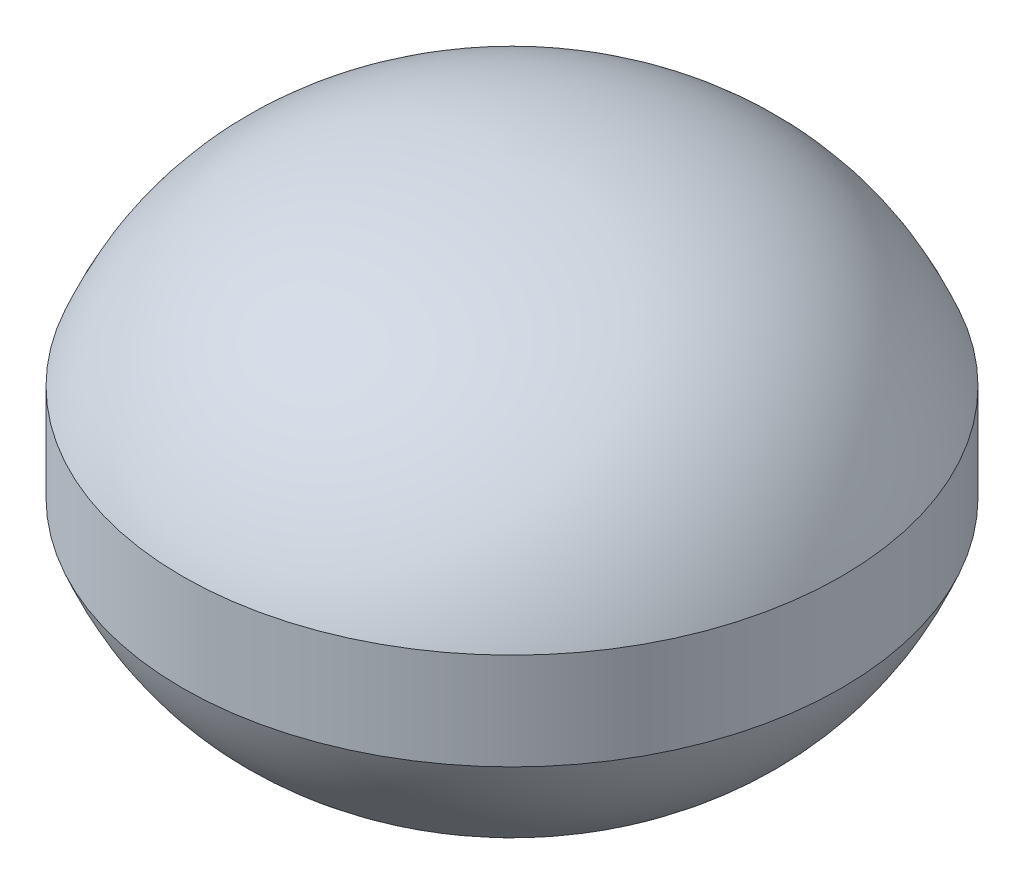
ISO-10303-21;
HEADER;
FILE_DESCRIPTION(('STEP AP214'),'2;1');
FILE_NAME('part.step','',(''),(''),'','','');
FILE_SCHEMA(('AUTOMOTIVE_DESIGN { 1 0 10303 214 1 1 1 1 }'));
ENDSEC;
DATA;
#1=APPLICATION_CONTEXT('core data for automotive mechanical design processes');
#2=APPLICATION_PROTOCOL_DEFINITION('international standard','automotive_design',2000,#1);
#3=PRODUCT_CONTEXT('',#1,'mechanical');
#4=PRODUCT('Part','Part','',(#3));
#5=PRODUCT_RELATED_PRODUCT_CATEGORY('part','',(#4));
#6=PRODUCT_DEFINITION_FORMATION('','',#4);
#7=PRODUCT_DEFINITION_CONTEXT('part definition',#1,'design');
#8=PRODUCT_DEFINITION('design','',#6,#7);
#9=PRODUCT_DEFINITION_SHAPE('','',#8);
#10=(LENGTH_UNIT() NAMED_UNIT(*) SI_UNIT(.MILLI.,.METRE.));
#11=(NAMED_UNIT(*) PLANE_ANGLE_UNIT() SI_UNIT($,.RADIAN.));
#12=(NAMED_UNIT(*) SI_UNIT($,.STERADIAN.) SOLID_ANGLE_UNIT());
#13=UNCERTAINTY_MEASURE_WITH_UNIT(LENGTH_MEASURE(1.E-05),#10,'distance_accuracy_value','');
#14=(GEOMETRIC_REPRESENTATION_CONTEXT(3) GLOBAL_UNCERTAINTY_ASSIGNED_CONTEXT((#13)) GLOBAL_UNIT_ASSIGNED_CONTEXT((#10,
#11,#12)) REPRESENTATION_CONTEXT('',''));
#15=CARTESIAN_POINT('',(0.,0.,0.));
#16=DIRECTION('',(0.,0.,1.));
#17=DIRECTION('',(1.,0.,0.));
#18=AXIS2_PLACEMENT_3D('',#15,#16,#17);
#19=CARTESIAN_POINT('',(0.,66.2,0.));
#20=DIRECTION('',(0.,-1.,0.));
#21=DIRECTION('',(0.,0.,-1.));
#22=AXIS2_PLACEMENT_3D('',#19,#20,#21);
#23=CYLINDRICAL_SURFACE('',#22,450.85);
#24=CARTESIAN_POINT('',(0.,66.2,0.));
#25=DIRECTION('',(0.,1.,0.));
#26=DIRECTION('',(0.,0.,1.));
#27=AXIS2_PLACEMENT_3D('',#24,#25,#26);
#28=CIRCLE('',#27,450.85);
#29=CARTESIAN_POINT('',(0.,66.2,450.85));
#30=VERTEX_POINT('',#29);
#31=EDGE_CURVE('E11',#30,#30,#28,.T.);
#32=ORIENTED_EDGE('',*,*,#31,.F.);
#33=EDGE_LOOP('',(#32));
#34=FACE_BOUND('',#33,.T.);
#35=CARTESIAN_POINT('',(0.,-66.2000000000002,0.));
#36=DIRECTION('',(0.,-1.,0.));
#37=DIRECTION('',(1.,0.,0.));
#38=AXIS2_PLACEMENT_3D('',#35,#36,#37);
#39=CIRCLE('',#38,450.85);
#40=CARTESIAN_POINT('',(450.85,-66.2000000000004,0.));
#41=VERTEX_POINT('',#40);
#42=EDGE_CURVE('E45',#41,#41,#39,.T.);
#43=ORIENTED_EDGE('',*,*,#42,.F.);
#44=EDGE_LOOP('',(#43));
#45=FACE_BOUND('',#44,.T.);
#46=ADVANCED_FACE('F38',(#34,#45),#23,.T.);
#47=CARTESIAN_POINT('',(0.,336.55,0.));
#48=CARTESIAN_POINT('',(-347.711285851528,328.659338564887,0.));
#49=CARTESIAN_POINT('',(-450.85,66.2,0.));
#50=B_SPLINE_CURVE_WITH_KNOTS('',2,(#47,#48,#49),.UNSPECIFIED.,.F.,.F.,(3,3),(0.,1.),.UNSPECIFIED.);
#51=CARTESIAN_POINT('',(0.,0.,0.));
#52=DIRECTION('',(0.,-1.,0.));
#53=AXIS1_PLACEMENT('',#51,#52);
#54=SURFACE_OF_REVOLUTION('',#50,#53);
#55=ORIENTED_EDGE('',*,*,#31,.T.);
#56=EDGE_LOOP('',(#55));
#57=FACE_BOUND('',#56,.T.);
#58=CARTESIAN_POINT('',(0.,336.55,0.));
#59=VERTEX_POINT('',#58);
#60=VERTEX_LOOP('',#59);
#61=FACE_BOUND('',#60,.T.);
#62=ADVANCED_FACE('F54',(#57,#61),#54,.T.);
#63=CARTESIAN_POINT('',(-450.85,-66.2000000000001,0.));
#64=CARTESIAN_POINT('',(-347.711285851528,-328.659338564887,0.));
#65=CARTESIAN_POINT('',(0.,-336.55,0.));
#66=B_SPLINE_CURVE_WITH_KNOTS('',2,(#63,#64,#65),.UNSPECIFIED.,.F.,.F.,(3,3),(0.,1.),.UNSPECIFIED.);
#67=CARTESIAN_POINT('',(0.,0.,0.));
#68=DIRECTION('',(0.,-1.,0.));
#69=AXIS1_PLACEMENT('',#67,#68);
#70=SURFACE_OF_REVOLUTION('',#66,#69);
#71=CARTESIAN_POINT('',(0.,-336.55,0.));
#72=VERTEX_POINT('',#71);
#73=VERTEX_LOOP('',#72);
#74=FACE_BOUND('',#73,.T.);
#75=ORIENTED_EDGE('',*,*,#42,.T.);
#76=EDGE_LOOP('',(#75));
#77=FACE_BOUND('',#76,.T.);
#78=ADVANCED_FACE('F51',(#74,#77),#70,.T.);
#79=CLOSED_SHELL('',(#46,#62,#78));
#80=MANIFOLD_SOLID_BREP('B2',#79);
#81=ADVANCED_BREP_SHAPE_REPRESENTATION('',(#18,#80),#14);
#82=SHAPE_DEFINITION_REPRESENTATION(#9,#81);
ENDSEC;
END-ISO-10303-21;
